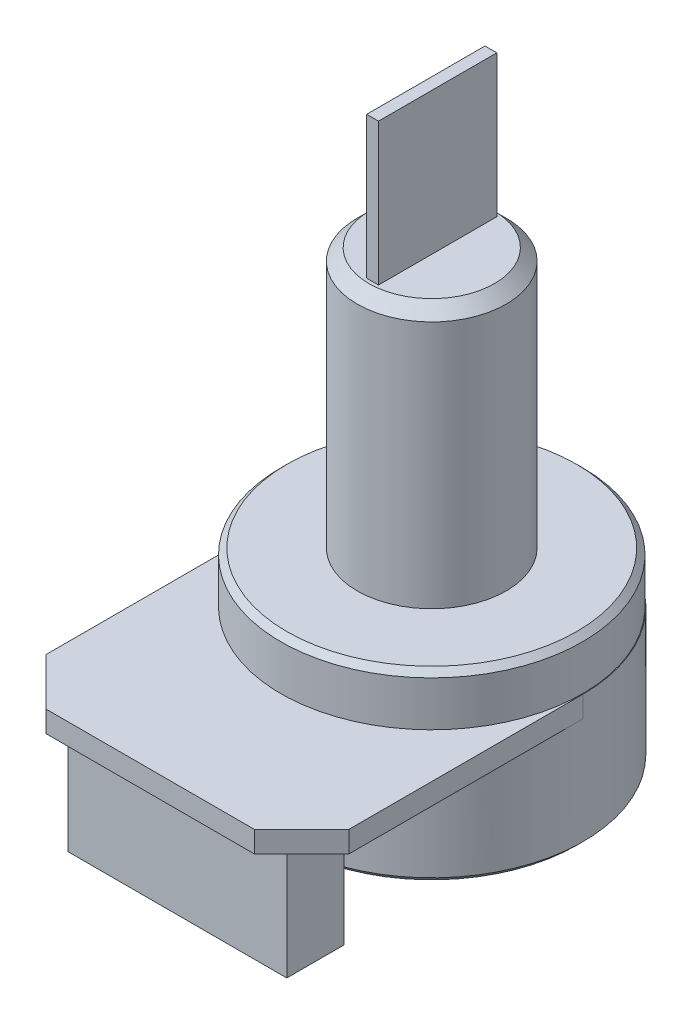
ISO-10303-21;
HEADER;
FILE_DESCRIPTION(('STEP AP214'),'2;1');
FILE_NAME('part.step','',(''),(''),'','','');
FILE_SCHEMA(('AUTOMOTIVE_DESIGN { 1 0 10303 214 1 1 1 1 }'));
ENDSEC;
DATA;
#1=APPLICATION_CONTEXT('core data for automotive mechanical design processes');
#2=APPLICATION_PROTOCOL_DEFINITION('international standard','automotive_design',2000,#1);
#3=PRODUCT_CONTEXT('',#1,'mechanical');
#4=PRODUCT('Part','Part','',(#3));
#5=PRODUCT_RELATED_PRODUCT_CATEGORY('part','',(#4));
#6=PRODUCT_DEFINITION_FORMATION('','',#4);
#7=PRODUCT_DEFINITION_CONTEXT('part definition',#1,'design');
#8=PRODUCT_DEFINITION('design','',#6,#7);
#9=PRODUCT_DEFINITION_SHAPE('','',#8);
#10=(LENGTH_UNIT() NAMED_UNIT(*) SI_UNIT(.MILLI.,.METRE.));
#11=(NAMED_UNIT(*) PLANE_ANGLE_UNIT() SI_UNIT($,.RADIAN.));
#12=(NAMED_UNIT(*) SI_UNIT($,.STERADIAN.) SOLID_ANGLE_UNIT());
#13=UNCERTAINTY_MEASURE_WITH_UNIT(LENGTH_MEASURE(1.E-05),#10,'distance_accuracy_value','');
#14=(GEOMETRIC_REPRESENTATION_CONTEXT(3) GLOBAL_UNCERTAINTY_ASSIGNED_CONTEXT((#13)) GLOBAL_UNIT_ASSIGNED_CONTEXT((#10,
#11,#12)) REPRESENTATION_CONTEXT('',''));
#15=CARTESIAN_POINT('',(0.,0.,0.));
#16=DIRECTION('',(0.,0.,1.));
#17=DIRECTION('',(1.,0.,0.));
#18=AXIS2_PLACEMENT_3D('',#15,#16,#17);
#19=CARTESIAN_POINT('',(0.,9.5,0.));
#20=DIRECTION('',(0.,-1.,0.));
#21=DIRECTION('',(0.,0.,-1.));
#22=AXIS2_PLACEMENT_3D('',#19,#20,#21);
#23=PLANE('',#22);
#24=DIRECTION('',(1.,0.,0.));
#25=VECTOR('',#24,1.);
#26=CARTESIAN_POINT('',(12.8,9.5,23.8));
#27=LINE('',#26,#25);
#28=CARTESIAN_POINT('',(-8.8,9.5,23.8));
#29=VERTEX_POINT('',#28);
#30=CARTESIAN_POINT('',(8.79999999999999,9.5,23.8));
#31=VERTEX_POINT('',#30);
#32=EDGE_CURVE('E225',#29,#31,#27,.T.);
#33=ORIENTED_EDGE('',*,*,#32,.F.);
#34=DIRECTION('',(0.707106781186546,0.,0.707106781186549));
#35=VECTOR('',#34,1.);
#36=CARTESIAN_POINT('',(-16.3,9.5,16.2999999999999));
#37=LINE('',#36,#35);
#38=CARTESIAN_POINT('',(-12.8,9.5,19.8));
#39=VERTEX_POINT('',#38);
#40=EDGE_CURVE('E260',#29,#39,#37,.F.);
#41=ORIENTED_EDGE('',*,*,#40,.T.);
#42=DIRECTION('',(0.,0.,1.));
#43=VECTOR('',#42,1.);
#44=CARTESIAN_POINT('',(-12.8,9.5,23.8));
#45=LINE('',#44,#43);
#46=CARTESIAN_POINT('',(-12.8,9.5,0.));
#47=VERTEX_POINT('',#46);
#48=EDGE_CURVE('E204',#47,#39,#45,.T.);
#49=ORIENTED_EDGE('',*,*,#48,.F.);
#50=CARTESIAN_POINT('',(0.,9.5,0.));
#51=DIRECTION('',(0.,1.,0.));
#52=DIRECTION('',(0.,0.,1.));
#53=AXIS2_PLACEMENT_3D('',#50,#51,#52);
#54=CIRCLE('',#53,12.8);
#55=CARTESIAN_POINT('',(12.8,9.5,0.));
#56=VERTEX_POINT('',#55);
#57=EDGE_CURVE('E212',#47,#56,#54,.T.);
#58=ORIENTED_EDGE('',*,*,#57,.T.);
#59=DIRECTION('',(0.,0.,-1.));
#60=VECTOR('',#59,1.);
#61=CARTESIAN_POINT('',(12.8,9.5,23.8));
#62=LINE('',#61,#60);
#63=CARTESIAN_POINT('',(12.8,9.5,19.8));
#64=VERTEX_POINT('',#63);
#65=EDGE_CURVE('E217',#64,#56,#62,.T.);
#66=ORIENTED_EDGE('',*,*,#65,.F.);
#67=DIRECTION('',(0.707106781186549,0.,-0.707106781186546));
#68=VECTOR('',#67,1.);
#69=CARTESIAN_POINT('',(16.3,9.5,16.3));
#70=LINE('',#69,#68);
#71=EDGE_CURVE('E258',#64,#31,#70,.F.);
#72=ORIENTED_EDGE('',*,*,#71,.T.);
#73=EDGE_LOOP('',(#33,#41,#49,#58,#66,#72));
#74=FACE_BOUND('',#73,.T.);
#75=DIRECTION('',(1.,0.,0.));
#76=VECTOR('',#75,1.);
#77=CARTESIAN_POINT('',(9.25768643719525,9.5,16.6827252048541));
#78=LINE('',#77,#76);
#79=CARTESIAN_POINT('',(-9.25768643719525,9.5,16.6827252048541));
#80=VERTEX_POINT('',#79);
#81=CARTESIAN_POINT('',(9.25768643719525,9.5,16.6827252048541));
#82=VERTEX_POINT('',#81);
#83=EDGE_CURVE('E173',#80,#82,#78,.T.);
#84=ORIENTED_EDGE('',*,*,#83,.F.);
#85=DIRECTION('',(0.,0.,-1.));
#86=VECTOR('',#85,1.);
#87=CARTESIAN_POINT('',(-9.25768643719525,9.5,16.6827252048541));
#88=LINE('',#87,#86);
#89=CARTESIAN_POINT('',(-9.25768643719525,9.5,21.5128224764342));
#90=VERTEX_POINT('',#89);
#91=EDGE_CURVE('E170',#90,#80,#88,.T.);
#92=ORIENTED_EDGE('',*,*,#91,.F.);
#93=DIRECTION('',(-1.,0.,0.));
#94=VECTOR('',#93,1.);
#95=CARTESIAN_POINT('',(9.25768643719525,9.5,21.5128224764342));
#96=LINE('',#95,#94);
#97=CARTESIAN_POINT('',(9.25768643719525,9.5,21.5128224764342));
#98=VERTEX_POINT('',#97);
#99=EDGE_CURVE('E183',#98,#90,#96,.T.);
#100=ORIENTED_EDGE('',*,*,#99,.F.);
#101=DIRECTION('',(0.,0.,1.));
#102=VECTOR('',#101,1.);
#103=CARTESIAN_POINT('',(9.25768643719525,9.5,16.6827252048541));
#104=LINE('',#103,#102);
#105=EDGE_CURVE('E191',#82,#98,#104,.T.);
#106=ORIENTED_EDGE('',*,*,#105,.F.);
#107=EDGE_LOOP('',(#84,#92,#100,#106));
#108=FACE_BOUND('',#107,.T.);
#109=ADVANCED_FACE('F41',(#74,#108),#23,.T.);
#110=CARTESIAN_POINT('',(0.,9.5,0.));
#111=DIRECTION('',(0.,-1.,0.));
#112=DIRECTION('',(0.,0.,-1.));
#113=AXIS2_PLACEMENT_3D('',#110,#111,#112);
#114=CYLINDRICAL_SURFACE('',#113,12.8);
#115=CARTESIAN_POINT('',(0.,0.49999999999999,0.));
#116=DIRECTION('',(0.,1.,0.));
#117=DIRECTION('',(0.,0.,1.));
#118=AXIS2_PLACEMENT_3D('',#115,#116,#117);
#119=CIRCLE('',#118,12.8);
#120=CARTESIAN_POINT('',(0.,0.49999999999999,12.8));
#121=VERTEX_POINT('',#120);
#122=EDGE_CURVE('E241',#121,#121,#119,.T.);
#123=ORIENTED_EDGE('',*,*,#122,.T.);
#124=EDGE_LOOP('',(#123));
#125=FACE_BOUND('',#124,.T.);
#126=ORIENTED_EDGE('',*,*,#57,.F.);
#127=DIRECTION('',(0.,-1.,0.));
#128=VECTOR('',#127,1.);
#129=CARTESIAN_POINT('',(-12.8,11.3,0.));
#130=LINE('',#129,#128);
#131=CARTESIAN_POINT('',(-12.8,11.3,0.));
#132=VERTEX_POINT('',#131);
#133=EDGE_CURVE('E231',#132,#47,#130,.T.);
#134=ORIENTED_EDGE('',*,*,#133,.F.);
#135=CARTESIAN_POINT('',(0.,11.3,0.));
#136=DIRECTION('',(0.,1.,0.));
#137=DIRECTION('',(0.,0.,-1.));
#138=AXIS2_PLACEMENT_3D('',#135,#136,#137);
#139=CIRCLE('',#138,12.8);
#140=CARTESIAN_POINT('',(12.8,11.3,0.));
#141=VERTEX_POINT('',#140);
#142=EDGE_CURVE('E213',#141,#132,#139,.T.);
#143=ORIENTED_EDGE('',*,*,#142,.F.);
#144=DIRECTION('',(0.,-1.,0.));
#145=VECTOR('',#144,1.);
#146=CARTESIAN_POINT('',(12.8,11.3,0.));
#147=LINE('',#146,#145);
#148=EDGE_CURVE('E223',#141,#56,#147,.T.);
#149=ORIENTED_EDGE('',*,*,#148,.T.);
#150=EDGE_LOOP('',(#126,#134,#143,#149));
#151=FACE_BOUND('',#150,.T.);
#152=ADVANCED_FACE('F280',(#125,#151),#114,.T.);
#153=CARTESIAN_POINT('',(0.,0.,0.));
#154=DIRECTION('',(0.,1.,0.));
#155=DIRECTION('',(0.,0.,1.));
#156=AXIS2_PLACEMENT_3D('',#153,#154,#155);
#157=PLANE('',#156);
#158=CARTESIAN_POINT('',(0.,0.,0.));
#159=DIRECTION('',(0.,1.,0.));
#160=DIRECTION('',(0.,0.,1.));
#161=AXIS2_PLACEMENT_3D('',#158,#159,#160);
#162=CIRCLE('',#161,12.3);
#163=CARTESIAN_POINT('',(0.,0.,12.3));
#164=VERTEX_POINT('',#163);
#165=EDGE_CURVE('E244',#164,#164,#162,.F.);
#166=ORIENTED_EDGE('',*,*,#165,.T.);
#167=EDGE_LOOP('',(#166));
#168=FACE_BOUND('',#167,.T.);
#169=ADVANCED_FACE('F298',(#168),#157,.F.);
#170=CARTESIAN_POINT('',(-12.8,11.3,23.8));
#171=DIRECTION('',(1.,0.,0.));
#172=DIRECTION('',(0.,0.,-1.));
#173=AXIS2_PLACEMENT_3D('',#170,#171,#172);
#174=PLANE('',#173);
#175=ORIENTED_EDGE('',*,*,#48,.T.);
#176=DIRECTION('',(0.,1.,0.));
#177=VECTOR('',#176,1.);
#178=CARTESIAN_POINT('',(-12.8,11.3,19.8));
#179=LINE('',#178,#177);
#180=CARTESIAN_POINT('',(-12.8,11.3,19.8));
#181=VERTEX_POINT('',#180);
#182=EDGE_CURVE('E65',#39,#181,#179,.T.);
#183=ORIENTED_EDGE('',*,*,#182,.T.);
#184=DIRECTION('',(0.,0.,1.));
#185=VECTOR('',#184,1.);
#186=CARTESIAN_POINT('',(-12.8,11.3,23.8));
#187=LINE('',#186,#185);
#188=EDGE_CURVE('E216',#132,#181,#187,.T.);
#189=ORIENTED_EDGE('',*,*,#188,.F.);
#190=ORIENTED_EDGE('',*,*,#133,.T.);
#191=EDGE_LOOP('',(#175,#183,#189,#190));
#192=FACE_BOUND('',#191,.T.);
#193=ADVANCED_FACE('F276',(#192),#174,.F.);
#194=CARTESIAN_POINT('',(12.8,11.3,23.8));
#195=DIRECTION('',(0.,0.,-1.));
#196=DIRECTION('',(-1.,0.,0.));
#197=AXIS2_PLACEMENT_3D('',#194,#195,#196);
#198=PLANE('',#197);
#199=DIRECTION('',(1.,0.,0.));
#200=VECTOR('',#199,1.);
#201=CARTESIAN_POINT('',(12.8,11.3,23.8));
#202=LINE('',#201,#200);
#203=CARTESIAN_POINT('',(-8.8,11.3,23.8));
#204=VERTEX_POINT('',#203);
#205=CARTESIAN_POINT('',(8.79999999999999,11.3,23.8));
#206=VERTEX_POINT('',#205);
#207=EDGE_CURVE('E219',#204,#206,#202,.T.);
#208=ORIENTED_EDGE('',*,*,#207,.F.);
#209=DIRECTION('',(0.,-1.,0.));
#210=VECTOR('',#209,1.);
#211=CARTESIAN_POINT('',(-8.8,11.3,23.8));
#212=LINE('',#211,#210);
#213=EDGE_CURVE('E255',#204,#29,#212,.T.);
#214=ORIENTED_EDGE('',*,*,#213,.T.);
#215=ORIENTED_EDGE('',*,*,#32,.T.);
#216=DIRECTION('',(0.,1.,0.));
#217=VECTOR('',#216,1.);
#218=CARTESIAN_POINT('',(8.79999999999999,11.3,23.8));
#219=LINE('',#218,#217);
#220=EDGE_CURVE('E253',#31,#206,#219,.T.);
#221=ORIENTED_EDGE('',*,*,#220,.T.);
#222=EDGE_LOOP('',(#208,#214,#215,#221));
#223=FACE_BOUND('',#222,.T.);
#224=ADVANCED_FACE('F269',(#223),#198,.F.);
#225=CARTESIAN_POINT('',(12.8,11.3,23.8));
#226=DIRECTION('',(-1.,0.,0.));
#227=DIRECTION('',(0.,0.,1.));
#228=AXIS2_PLACEMENT_3D('',#225,#226,#227);
#229=PLANE('',#228);
#230=DIRECTION('',(0.,0.,-1.));
#231=VECTOR('',#230,1.);
#232=CARTESIAN_POINT('',(12.8,11.3,23.8));
#233=LINE('',#232,#231);
#234=CARTESIAN_POINT('',(12.8,11.3,19.8));
#235=VERTEX_POINT('',#234);
#236=EDGE_CURVE('E221',#235,#141,#233,.T.);
#237=ORIENTED_EDGE('',*,*,#236,.F.);
#238=DIRECTION('',(0.,-1.,0.));
#239=VECTOR('',#238,1.);
#240=CARTESIAN_POINT('',(12.8,11.3,19.8));
#241=LINE('',#240,#239);
#242=EDGE_CURVE('E12',#235,#64,#241,.T.);
#243=ORIENTED_EDGE('',*,*,#242,.T.);
#244=ORIENTED_EDGE('',*,*,#65,.T.);
#245=ORIENTED_EDGE('',*,*,#148,.F.);
#246=EDGE_LOOP('',(#237,#243,#244,#245));
#247=FACE_BOUND('',#246,.T.);
#248=ADVANCED_FACE('F284',(#247),#229,.F.);
#249=CARTESIAN_POINT('',(0.,11.3,0.));
#250=DIRECTION('',(0.,-1.,0.));
#251=DIRECTION('',(0.,0.,-1.));
#252=AXIS2_PLACEMENT_3D('',#249,#250,#251);
#253=PLANE('',#252);
#254=CARTESIAN_POINT('',(0.,11.3,0.));
#255=DIRECTION('',(0.,1.,0.));
#256=DIRECTION('',(0.,0.,1.));
#257=AXIS2_PLACEMENT_3D('',#254,#255,#256);
#258=CIRCLE('',#257,12.75);
#259=CARTESIAN_POINT('',(0.,11.3,-12.75));
#260=VERTEX_POINT('',#259);
#261=EDGE_CURVE('E209',#260,#260,#258,.T.);
#262=ORIENTED_EDGE('',*,*,#261,.F.);
#263=EDGE_LOOP('',(#262));
#264=FACE_BOUND('',#263,.T.);
#265=ORIENTED_EDGE('',*,*,#188,.T.);
#266=DIRECTION('',(-0.707106781186546,0.,-0.707106781186549));
#267=VECTOR('',#266,1.);
#268=CARTESIAN_POINT('',(-8.8,11.3,23.8));
#269=LINE('',#268,#267);
#270=EDGE_CURVE('E50',#181,#204,#269,.F.);
#271=ORIENTED_EDGE('',*,*,#270,.T.);
#272=ORIENTED_EDGE('',*,*,#207,.T.);
#273=DIRECTION('',(-0.707106781186549,0.,0.707106781186546));
#274=VECTOR('',#273,1.);
#275=CARTESIAN_POINT('',(12.8,11.3,19.8));
#276=LINE('',#275,#274);
#277=EDGE_CURVE('E57',#206,#235,#276,.F.);
#278=ORIENTED_EDGE('',*,*,#277,.T.);
#279=ORIENTED_EDGE('',*,*,#236,.T.);
#280=ORIENTED_EDGE('',*,*,#142,.T.);
#281=EDGE_LOOP('',(#265,#271,#272,#278,#279,#280));
#282=FACE_BOUND('',#281,.T.);
#283=ADVANCED_FACE('F265',(#264,#282),#253,.F.);
#284=CARTESIAN_POINT('',(0.,67.2624458405139,0.));
#285=DIRECTION('',(0.,-1.,0.));
#286=DIRECTION('',(0.,0.,-1.));
#287=AXIS2_PLACEMENT_3D('',#284,#285,#286);
#288=CYLINDRICAL_SURFACE('',#287,12.75);
#289=CARTESIAN_POINT('',(0.,15.1000000000001,0.));
#290=DIRECTION('',(0.,1.,0.));
#291=DIRECTION('',(0.,0.,1.));
#292=AXIS2_PLACEMENT_3D('',#289,#290,#291);
#293=CIRCLE('',#292,12.75);
#294=CARTESIAN_POINT('',(0.,15.1000000000001,-12.75));
#295=VERTEX_POINT('',#294);
#296=EDGE_CURVE('E250',#295,#295,#293,.F.);
#297=CARTESIAN_POINT('',(0.,15.1000000000001,-12.75));
#298=CARTESIAN_POINT('',(0.,15.0604166666667,-12.75));
#299=CARTESIAN_POINT('',(0.,15.0208333333334,-12.75));
#300=CARTESIAN_POINT('',(0.,14.9416666666667,-12.75));
#301=CARTESIAN_POINT('',(0.,14.9020833333334,-12.75));
#302=CARTESIAN_POINT('',(0.,14.8229166666667,-12.75));
#303=CARTESIAN_POINT('',(0.,14.7833333333334,-12.75));
#304=CARTESIAN_POINT('',(0.,14.7041666666667,-12.75));
#305=CARTESIAN_POINT('',(0.,14.6645833333334,-12.75));
#306=CARTESIAN_POINT('',(0.,14.5854166666667,-12.75));
#307=CARTESIAN_POINT('',(0.,14.5458333333334,-12.75));
#308=CARTESIAN_POINT('',(0.,14.4666666666667,-12.75));
#309=CARTESIAN_POINT('',(0.,14.4270833333334,-12.75));
#310=CARTESIAN_POINT('',(0.,14.3479166666667,-12.75));
#311=CARTESIAN_POINT('',(0.,14.3083333333334,-12.75));
#312=CARTESIAN_POINT('',(0.,14.2291666666667,-12.75));
#313=CARTESIAN_POINT('',(0.,14.1895833333334,-12.75));
#314=CARTESIAN_POINT('',(0.,14.1104166666667,-12.75));
#315=CARTESIAN_POINT('',(0.,14.0708333333334,-12.75));
#316=CARTESIAN_POINT('',(0.,13.9916666666667,-12.75));
#317=CARTESIAN_POINT('',(0.,13.9520833333334,-12.75));
#318=CARTESIAN_POINT('',(0.,13.8729166666667,-12.75));
#319=CARTESIAN_POINT('',(0.,13.8333333333334,-12.75));
#320=CARTESIAN_POINT('',(0.,13.7541666666667,-12.75));
#321=CARTESIAN_POINT('',(0.,13.7145833333334,-12.75));
#322=CARTESIAN_POINT('',(0.,13.6354166666667,-12.75));
#323=CARTESIAN_POINT('',(0.,13.5958333333334,-12.75));
#324=CARTESIAN_POINT('',(0.,13.5166666666667,-12.75));
#325=CARTESIAN_POINT('',(0.,13.4770833333334,-12.75));
#326=CARTESIAN_POINT('',(0.,13.3979166666667,-12.75));
#327=CARTESIAN_POINT('',(0.,13.3583333333334,-12.75));
#328=CARTESIAN_POINT('',(0.,13.2791666666667,-12.75));
#329=CARTESIAN_POINT('',(0.,13.2395833333334,-12.75));
#330=CARTESIAN_POINT('',(0.,13.1604166666667,-12.75));
#331=CARTESIAN_POINT('',(0.,13.1208333333334,-12.75));
#332=CARTESIAN_POINT('',(0.,13.0416666666667,-12.75));
#333=CARTESIAN_POINT('',(0.,13.0020833333334,-12.75));
#334=CARTESIAN_POINT('',(0.,12.9229166666667,-12.75));
#335=CARTESIAN_POINT('',(0.,12.8833333333334,-12.75));
#336=CARTESIAN_POINT('',(0.,12.8041666666667,-12.75));
#337=CARTESIAN_POINT('',(0.,12.7645833333334,-12.75));
#338=CARTESIAN_POINT('',(0.,12.6854166666667,-12.75));
#339=CARTESIAN_POINT('',(0.,12.6458333333333,-12.75));
#340=CARTESIAN_POINT('',(0.,12.5666666666667,-12.75));
#341=CARTESIAN_POINT('',(0.,12.5270833333333,-12.75));
#342=CARTESIAN_POINT('',(0.,12.4479166666667,-12.75));
#343=CARTESIAN_POINT('',(0.,12.4083333333333,-12.75));
#344=CARTESIAN_POINT('',(0.,12.3291666666667,-12.75));
#345=CARTESIAN_POINT('',(0.,12.2895833333333,-12.75));
#346=CARTESIAN_POINT('',(0.,12.2104166666667,-12.75));
#347=CARTESIAN_POINT('',(0.,12.1708333333333,-12.75));
#348=CARTESIAN_POINT('',(0.,12.0916666666667,-12.75));
#349=CARTESIAN_POINT('',(0.,12.0520833333333,-12.75));
#350=CARTESIAN_POINT('',(0.,11.9729166666667,-12.75));
#351=CARTESIAN_POINT('',(0.,11.9333333333333,-12.75));
#352=CARTESIAN_POINT('',(0.,11.8541666666667,-12.75));
#353=CARTESIAN_POINT('',(0.,11.8145833333333,-12.75));
#354=CARTESIAN_POINT('',(0.,11.7354166666667,-12.75));
#355=CARTESIAN_POINT('',(0.,11.6958333333333,-12.75));
#356=CARTESIAN_POINT('',(0.,11.6166666666667,-12.75));
#357=CARTESIAN_POINT('',(0.,11.5770833333333,-12.75));
#358=CARTESIAN_POINT('',(0.,11.4979166666667,-12.75));
#359=CARTESIAN_POINT('',(0.,11.4583333333333,-12.75));
#360=CARTESIAN_POINT('',(0.,11.3791666666667,-12.75));
#361=CARTESIAN_POINT('',(0.,11.3395833333333,-12.75));
#362=CARTESIAN_POINT('',(0.,11.3,-12.75));
#363=B_SPLINE_CURVE_WITH_KNOTS('',3,(#297,#298,#299,#300,#301,#302,#303,#304,#305,#306,#307,
#308,#309,#310,#311,#312,#313,#314,#315,#316,#317,#318,#319,#320,#321,#322,#323,#324,#325,#326,
#327,#328,#329,#330,#331,#332,#333,#334,#335,#336,#337,#338,#339,#340,#341,#342,#343,#344,#345,
#346,#347,#348,#349,#350,#351,#352,#353,#354,#355,#356,#357,#358,#359,#360,#361,#362),
.UNSPECIFIED.,.F.,.F.,(4,2,2,2,2,2,2,2,2,2,2,2,2,2,2,2,2,2,2,2,2,2,2,2,2,2,2,2,2,2,2,2,4),(0.,
0.118750000000001,0.237500000000002,0.356250000000002,0.475000000000003,0.593750000000011,
0.712500000000012,0.831250000000012,0.950000000000013,1.06875000000001,1.18750000000001,
1.30625000000002,1.42500000000002,1.54375000000002,1.66250000000002,1.78125000000003,
1.90000000000003,2.01875000000003,2.13750000000003,2.25625000000003,2.37500000000003,
2.49375000000004,2.61250000000004,2.73125000000004,2.85000000000004,2.96875000000004,
3.08750000000004,3.20625000000004,3.32500000000005,3.44375000000005,3.56250000000005,
3.68125000000005,3.80000000000005),.UNSPECIFIED.);
#364=EDGE_CURVE('BSEAM353',#295,#260,#363,.T.);
#365=ORIENTED_EDGE('',*,*,#296,.T.);
#366=ORIENTED_EDGE('',*,*,#261,.T.);
#367=ORIENTED_EDGE('',*,*,#364,.T.);
#368=ORIENTED_EDGE('',*,*,#364,.F.);
#369=EDGE_LOOP('',(#365,#367,#366,#368));
#370=FACE_BOUND('',#369,.T.);
#371=ADVANCED_FACE('F353',(#370),#288,.T.);
#372=CARTESIAN_POINT('',(0.,15.6,0.));
#373=DIRECTION('',(0.,1.,0.));
#374=DIRECTION('',(0.,0.,1.));
#375=AXIS2_PLACEMENT_3D('',#372,#373,#374);
#376=PLANE('',#375);
#377=CARTESIAN_POINT('',(0.,15.6,0.));
#378=DIRECTION('',(0.,1.,0.));
#379=DIRECTION('',(0.,0.,1.));
#380=AXIS2_PLACEMENT_3D('',#377,#378,#379);
#381=CIRCLE('',#380,12.2500000000001);
#382=CARTESIAN_POINT('',(0.,15.6,12.2500000000001));
#383=VERTEX_POINT('',#382);
#384=EDGE_CURVE('E247',#383,#383,#381,.T.);
#385=ORIENTED_EDGE('',*,*,#384,.T.);
#386=EDGE_LOOP('',(#385));
#387=FACE_BOUND('',#386,.T.);
#388=CARTESIAN_POINT('',(0.,15.6,0.));
#389=DIRECTION('',(0.,1.,0.));
#390=DIRECTION('',(0.,0.,1.));
#391=AXIS2_PLACEMENT_3D('',#388,#389,#390);
#392=CIRCLE('',#391,6.3);
#393=CARTESIAN_POINT('',(0.,15.6,6.3));
#394=VERTEX_POINT('',#393);
#395=EDGE_CURVE('E205',#394,#394,#392,.T.);
#396=ORIENTED_EDGE('',*,*,#395,.F.);
#397=EDGE_LOOP('',(#396));
#398=FACE_BOUND('',#397,.T.);
#399=ADVANCED_FACE('F349',(#387,#398),#376,.T.);
#400=CARTESIAN_POINT('',(0.,93.019090885901,0.));
#401=DIRECTION('',(0.,-1.,0.));
#402=DIRECTION('',(0.,0.,-1.));
#403=AXIS2_PLACEMENT_3D('',#400,#401,#402);
#404=CYLINDRICAL_SURFACE('',#403,6.3);
#405=CARTESIAN_POINT('',(0.,36.6,0.));
#406=DIRECTION('',(0.,1.,0.));
#407=DIRECTION('',(0.,0.,1.));
#408=AXIS2_PLACEMENT_3D('',#405,#406,#407);
#409=CIRCLE('',#408,6.3);
#410=CARTESIAN_POINT('',(0.,36.6,6.3));
#411=VERTEX_POINT('',#410);
#412=EDGE_CURVE('E238',#411,#411,#409,.F.);
#413=ORIENTED_EDGE('',*,*,#412,.T.);
#414=EDGE_LOOP('',(#413));
#415=FACE_BOUND('',#414,.T.);
#416=ORIENTED_EDGE('',*,*,#395,.T.);
#417=EDGE_LOOP('',(#416));
#418=FACE_BOUND('',#417,.T.);
#419=ADVANCED_FACE('F352',(#415,#418),#404,.T.);
#420=CARTESIAN_POINT('',(0.,37.6,0.));
#421=DIRECTION('',(0.,1.,0.));
#422=DIRECTION('',(0.,0.,1.));
#423=AXIS2_PLACEMENT_3D('',#420,#421,#422);
#424=PLANE('',#423);
#425=DIRECTION('',(0.,0.,-1.));
#426=VECTOR('',#425,1.);
#427=CARTESIAN_POINT('',(0.5,37.6,5.));
#428=LINE('',#427,#426);
#429=CARTESIAN_POINT('',(0.5,37.6,5.));
#430=VERTEX_POINT('',#429);
#431=CARTESIAN_POINT('',(0.5,37.6,-5.));
#432=VERTEX_POINT('',#431);
#433=EDGE_CURVE('E169',#430,#432,#428,.T.);
#434=ORIENTED_EDGE('',*,*,#433,.F.);
#435=DIRECTION('',(1.,0.,0.));
#436=VECTOR('',#435,1.);
#437=CARTESIAN_POINT('',(-0.5,37.6,5.));
#438=LINE('',#437,#436);
#439=CARTESIAN_POINT('',(-0.5,37.6,5.));
#440=VERTEX_POINT('',#439);
#441=EDGE_CURVE('E166',#440,#430,#438,.T.);
#442=ORIENTED_EDGE('',*,*,#441,.F.);
#443=DIRECTION('',(0.,0.,1.));
#444=VECTOR('',#443,1.);
#445=CARTESIAN_POINT('',(-0.5,37.6,5.));
#446=LINE('',#445,#444);
#447=CARTESIAN_POINT('',(-0.5,37.6,-5.));
#448=VERTEX_POINT('',#447);
#449=EDGE_CURVE('E615',#448,#440,#446,.T.);
#450=ORIENTED_EDGE('',*,*,#449,.F.);
#451=DIRECTION('',(-1.,0.,0.));
#452=VECTOR('',#451,1.);
#453=CARTESIAN_POINT('',(-0.5,37.6,-5.));
#454=LINE('',#453,#452);
#455=EDGE_CURVE('E617',#432,#448,#454,.T.);
#456=ORIENTED_EDGE('',*,*,#455,.F.);
#457=EDGE_LOOP('',(#434,#442,#450,#456));
#458=FACE_BOUND('',#457,.T.);
#459=CARTESIAN_POINT('',(0.,37.6,0.));
#460=DIRECTION('',(0.,1.,0.));
#461=DIRECTION('',(0.,0.,1.));
#462=AXIS2_PLACEMENT_3D('',#459,#460,#461);
#463=CIRCLE('',#462,5.30000000000001);
#464=CARTESIAN_POINT('',(0.,37.6,5.30000000000001));
#465=VERTEX_POINT('',#464);
#466=EDGE_CURVE('E208',#465,#465,#463,.T.);
#467=ORIENTED_EDGE('',*,*,#466,.T.);
#468=EDGE_LOOP('',(#467));
#469=FACE_BOUND('',#468,.T.);
#470=ADVANCED_FACE('F320',(#458,#469),#424,.T.);
#471=CARTESIAN_POINT('',(0.,37.6,0.));
#472=DIRECTION('',(0.,-1.,0.));
#473=DIRECTION('',(0.,0.,-1.));
#474=AXIS2_PLACEMENT_3D('',#471,#472,#473);
#475=CONICAL_SURFACE('',#474,5.30000000000001,0.785398163397449);
#476=ORIENTED_EDGE('',*,*,#412,.F.);
#477=EDGE_LOOP('',(#476));
#478=FACE_BOUND('',#477,.T.);
#479=ORIENTED_EDGE('',*,*,#466,.F.);
#480=EDGE_LOOP('',(#479));
#481=FACE_BOUND('',#480,.T.);
#482=ADVANCED_FACE('F313',(#478,#481),#475,.T.);
#483=CARTESIAN_POINT('',(0.,0.49999999999999,0.));
#484=DIRECTION('',(0.,1.,0.));
#485=DIRECTION('',(0.,0.,1.));
#486=AXIS2_PLACEMENT_3D('',#483,#484,#485);
#487=CONICAL_SURFACE('',#486,12.8,0.785398163397454);
#488=ORIENTED_EDGE('',*,*,#165,.F.);
#489=EDGE_LOOP('',(#488));
#490=FACE_BOUND('',#489,.T.);
#491=ORIENTED_EDGE('',*,*,#122,.F.);
#492=EDGE_LOOP('',(#491));
#493=FACE_BOUND('',#492,.T.);
#494=ADVANCED_FACE('F319',(#490,#493),#487,.T.);
#495=CARTESIAN_POINT('',(0.,15.6,0.));
#496=DIRECTION('',(0.,-1.,0.));
#497=DIRECTION('',(0.,0.,-1.));
#498=AXIS2_PLACEMENT_3D('',#495,#496,#497);
#499=CONICAL_SURFACE('',#498,12.2500000000001,0.785398163397447);
#500=ORIENTED_EDGE('',*,*,#296,.F.);
#501=EDGE_LOOP('',(#500));
#502=FACE_BOUND('',#501,.T.);
#503=ORIENTED_EDGE('',*,*,#384,.F.);
#504=EDGE_LOOP('',(#503));
#505=FACE_BOUND('',#504,.T.);
#506=ADVANCED_FACE('F327',(#502,#505),#499,.T.);
#507=CARTESIAN_POINT('',(-9.25768643719525,-0.5,16.6827252048541));
#508=DIRECTION('',(1.,0.,0.));
#509=DIRECTION('',(0.,0.,-1.));
#510=AXIS2_PLACEMENT_3D('',#507,#508,#509);
#511=PLANE('',#510);
#512=ORIENTED_EDGE('',*,*,#91,.T.);
#513=DIRECTION('',(0.,1.,0.));
#514=VECTOR('',#513,1.);
#515=CARTESIAN_POINT('',(-9.25768643719525,-0.5,16.6827252048541));
#516=LINE('',#515,#514);
#517=CARTESIAN_POINT('',(-9.25768643719525,-0.5,16.6827252048541));
#518=VERTEX_POINT('',#517);
#519=EDGE_CURVE('E202',#518,#80,#516,.T.);
#520=ORIENTED_EDGE('',*,*,#519,.F.);
#521=DIRECTION('',(0.,0.,-1.));
#522=VECTOR('',#521,1.);
#523=CARTESIAN_POINT('',(-9.25768643719525,-0.5,16.6827252048541));
#524=LINE('',#523,#522);
#525=CARTESIAN_POINT('',(-9.25768643719525,-0.5,21.5128224764342));
#526=VERTEX_POINT('',#525);
#527=EDGE_CURVE('E179',#526,#518,#524,.T.);
#528=ORIENTED_EDGE('',*,*,#527,.F.);
#529=DIRECTION('',(0.,1.,0.));
#530=VECTOR('',#529,1.);
#531=CARTESIAN_POINT('',(-9.25768643719525,-0.5,21.5128224764342));
#532=LINE('',#531,#530);
#533=EDGE_CURVE('E188',#526,#90,#532,.T.);
#534=ORIENTED_EDGE('',*,*,#533,.T.);
#535=EDGE_LOOP('',(#512,#520,#528,#534));
#536=FACE_BOUND('',#535,.T.);
#537=ADVANCED_FACE('F333',(#536),#511,.F.);
#538=CARTESIAN_POINT('',(9.25768643719525,-0.5,16.6827252048541));
#539=DIRECTION('',(0.,0.,1.));
#540=DIRECTION('',(1.,0.,0.));
#541=AXIS2_PLACEMENT_3D('',#538,#539,#540);
#542=PLANE('',#541);
#543=ORIENTED_EDGE('',*,*,#83,.T.);
#544=DIRECTION('',(0.,1.,0.));
#545=VECTOR('',#544,1.);
#546=CARTESIAN_POINT('',(9.25768643719525,-0.5,16.6827252048541));
#547=LINE('',#546,#545);
#548=CARTESIAN_POINT('',(9.25768643719525,-0.5,16.6827252048541));
#549=VERTEX_POINT('',#548);
#550=EDGE_CURVE('E199',#549,#82,#547,.T.);
#551=ORIENTED_EDGE('',*,*,#550,.F.);
#552=DIRECTION('',(1.,0.,0.));
#553=VECTOR('',#552,1.);
#554=CARTESIAN_POINT('',(9.25768643719525,-0.5,16.6827252048541));
#555=LINE('',#554,#553);
#556=EDGE_CURVE('E182',#518,#549,#555,.T.);
#557=ORIENTED_EDGE('',*,*,#556,.F.);
#558=ORIENTED_EDGE('',*,*,#519,.T.);
#559=EDGE_LOOP('',(#543,#551,#557,#558));
#560=FACE_BOUND('',#559,.T.);
#561=ADVANCED_FACE('F342',(#560),#542,.F.);
#562=CARTESIAN_POINT('',(9.25768643719525,-0.5,16.6827252048541));
#563=DIRECTION('',(-1.,0.,0.));
#564=DIRECTION('',(0.,0.,1.));
#565=AXIS2_PLACEMENT_3D('',#562,#563,#564);
#566=PLANE('',#565);
#567=ORIENTED_EDGE('',*,*,#105,.T.);
#568=DIRECTION('',(0.,1.,0.));
#569=VECTOR('',#568,1.);
#570=CARTESIAN_POINT('',(9.25768643719525,-0.5,21.5128224764342));
#571=LINE('',#570,#569);
#572=CARTESIAN_POINT('',(9.25768643719525,-0.5,21.5128224764342));
#573=VERTEX_POINT('',#572);
#574=EDGE_CURVE('E197',#573,#98,#571,.T.);
#575=ORIENTED_EDGE('',*,*,#574,.F.);
#576=DIRECTION('',(0.,0.,1.));
#577=VECTOR('',#576,1.);
#578=CARTESIAN_POINT('',(9.25768643719525,-0.5,16.6827252048541));
#579=LINE('',#578,#577);
#580=EDGE_CURVE('E185',#549,#573,#579,.T.);
#581=ORIENTED_EDGE('',*,*,#580,.F.);
#582=ORIENTED_EDGE('',*,*,#550,.T.);
#583=EDGE_LOOP('',(#567,#575,#581,#582));
#584=FACE_BOUND('',#583,.T.);
#585=ADVANCED_FACE('F454',(#584),#566,.F.);
#586=CARTESIAN_POINT('',(9.25768643719525,-0.5,21.5128224764342));
#587=DIRECTION('',(0.,0.,-1.));
#588=DIRECTION('',(-1.,0.,0.));
#589=AXIS2_PLACEMENT_3D('',#586,#587,#588);
#590=PLANE('',#589);
#591=ORIENTED_EDGE('',*,*,#99,.T.);
#592=ORIENTED_EDGE('',*,*,#533,.F.);
#593=DIRECTION('',(-1.,0.,0.));
#594=VECTOR('',#593,1.);
#595=CARTESIAN_POINT('',(9.25768643719525,-0.5,21.5128224764342));
#596=LINE('',#595,#594);
#597=EDGE_CURVE('E187',#573,#526,#596,.T.);
#598=ORIENTED_EDGE('',*,*,#597,.F.);
#599=ORIENTED_EDGE('',*,*,#574,.T.);
#600=EDGE_LOOP('',(#591,#592,#598,#599));
#601=FACE_BOUND('',#600,.T.);
#602=ADVANCED_FACE('F444',(#601),#590,.F.);
#603=CARTESIAN_POINT('',(0.,-0.5,0.));
#604=DIRECTION('',(0.,-1.,0.));
#605=DIRECTION('',(0.,0.,-1.));
#606=AXIS2_PLACEMENT_3D('',#603,#604,#605);
#607=PLANE('',#606);
#608=ORIENTED_EDGE('',*,*,#527,.T.);
#609=ORIENTED_EDGE('',*,*,#556,.T.);
#610=ORIENTED_EDGE('',*,*,#580,.T.);
#611=ORIENTED_EDGE('',*,*,#597,.T.);
#612=EDGE_LOOP('',(#608,#609,#610,#611));
#613=FACE_BOUND('',#612,.T.);
#614=ADVANCED_FACE('F435',(#613),#607,.T.);
#615=CARTESIAN_POINT('',(0.5,49.6,5.));
#616=DIRECTION('',(-1.,0.,0.));
#617=DIRECTION('',(0.,0.,1.));
#618=AXIS2_PLACEMENT_3D('',#615,#616,#617);
#619=PLANE('',#618);
#620=ORIENTED_EDGE('',*,*,#433,.T.);
#621=DIRECTION('',(0.,-1.,0.));
#622=VECTOR('',#621,1.);
#623=CARTESIAN_POINT('',(0.5,49.6,-5.));
#624=LINE('',#623,#622);
#625=CARTESIAN_POINT('',(0.5,49.6,-5.));
#626=VERTEX_POINT('',#625);
#627=EDGE_CURVE('E150',#626,#432,#624,.T.);
#628=ORIENTED_EDGE('',*,*,#627,.F.);
#629=DIRECTION('',(0.,0.,-1.));
#630=VECTOR('',#629,1.);
#631=CARTESIAN_POINT('',(0.5,49.6,5.));
#632=LINE('',#631,#630);
#633=CARTESIAN_POINT('',(0.5,49.6,5.));
#634=VERTEX_POINT('',#633);
#635=EDGE_CURVE('E157',#634,#626,#632,.T.);
#636=ORIENTED_EDGE('',*,*,#635,.F.);
#637=DIRECTION('',(0.,-1.,0.));
#638=VECTOR('',#637,1.);
#639=CARTESIAN_POINT('',(0.5,49.6,5.));
#640=LINE('',#639,#638);
#641=EDGE_CURVE('E620',#634,#430,#640,.T.);
#642=ORIENTED_EDGE('',*,*,#641,.T.);
#643=EDGE_LOOP('',(#620,#628,#636,#642));
#644=FACE_BOUND('',#643,.T.);
#645=ADVANCED_FACE('F168',(#644),#619,.F.);
#646=CARTESIAN_POINT('',(-0.5,49.6,-5.));
#647=DIRECTION('',(0.,0.,1.));
#648=DIRECTION('',(1.,0.,0.));
#649=AXIS2_PLACEMENT_3D('',#646,#647,#648);
#650=PLANE('',#649);
#651=ORIENTED_EDGE('',*,*,#455,.T.);
#652=DIRECTION('',(0.,-1.,0.));
#653=VECTOR('',#652,1.);
#654=CARTESIAN_POINT('',(-0.5,49.6,-5.));
#655=LINE('',#654,#653);
#656=CARTESIAN_POINT('',(-0.5,49.6,-5.));
#657=VERTEX_POINT('',#656);
#658=EDGE_CURVE('E153',#657,#448,#655,.T.);
#659=ORIENTED_EDGE('',*,*,#658,.F.);
#660=DIRECTION('',(-1.,0.,0.));
#661=VECTOR('',#660,1.);
#662=CARTESIAN_POINT('',(-0.5,49.6,-5.));
#663=LINE('',#662,#661);
#664=EDGE_CURVE('E145',#626,#657,#663,.T.);
#665=ORIENTED_EDGE('',*,*,#664,.F.);
#666=ORIENTED_EDGE('',*,*,#627,.T.);
#667=EDGE_LOOP('',(#651,#659,#665,#666));
#668=FACE_BOUND('',#667,.T.);
#669=ADVANCED_FACE('F148',(#668),#650,.F.);
#670=CARTESIAN_POINT('',(-0.5,49.6,5.));
#671=DIRECTION('',(1.,0.,0.));
#672=DIRECTION('',(0.,0.,-1.));
#673=AXIS2_PLACEMENT_3D('',#670,#671,#672);
#674=PLANE('',#673);
#675=ORIENTED_EDGE('',*,*,#449,.T.);
#676=DIRECTION('',(0.,-1.,0.));
#677=VECTOR('',#676,1.);
#678=CARTESIAN_POINT('',(-0.5,49.6,5.));
#679=LINE('',#678,#677);
#680=CARTESIAN_POINT('',(-0.5,49.6,5.));
#681=VERTEX_POINT('',#680);
#682=EDGE_CURVE('E175',#681,#440,#679,.T.);
#683=ORIENTED_EDGE('',*,*,#682,.F.);
#684=DIRECTION('',(0.,0.,1.));
#685=VECTOR('',#684,1.);
#686=CARTESIAN_POINT('',(-0.5,49.6,5.));
#687=LINE('',#686,#685);
#688=EDGE_CURVE('E156',#657,#681,#687,.T.);
#689=ORIENTED_EDGE('',*,*,#688,.F.);
#690=ORIENTED_EDGE('',*,*,#658,.T.);
#691=EDGE_LOOP('',(#675,#683,#689,#690));
#692=FACE_BOUND('',#691,.T.);
#693=ADVANCED_FACE('F408',(#692),#674,.F.);
#694=CARTESIAN_POINT('',(-0.5,49.6,5.));
#695=DIRECTION('',(0.,0.,-1.));
#696=DIRECTION('',(-1.,0.,0.));
#697=AXIS2_PLACEMENT_3D('',#694,#695,#696);
#698=PLANE('',#697);
#699=ORIENTED_EDGE('',*,*,#441,.T.);
#700=ORIENTED_EDGE('',*,*,#641,.F.);
#701=DIRECTION('',(1.,0.,0.));
#702=VECTOR('',#701,1.);
#703=CARTESIAN_POINT('',(-0.5,49.6,5.));
#704=LINE('',#703,#702);
#705=EDGE_CURVE('E162',#681,#634,#704,.T.);
#706=ORIENTED_EDGE('',*,*,#705,.F.);
#707=ORIENTED_EDGE('',*,*,#682,.T.);
#708=EDGE_LOOP('',(#699,#700,#706,#707));
#709=FACE_BOUND('',#708,.T.);
#710=ADVANCED_FACE('F400',(#709),#698,.F.);
#711=CARTESIAN_POINT('',(0.,49.6,0.));
#712=DIRECTION('',(0.,-1.,0.));
#713=DIRECTION('',(0.,0.,-1.));
#714=AXIS2_PLACEMENT_3D('',#711,#712,#713);
#715=PLANE('',#714);
#716=ORIENTED_EDGE('',*,*,#635,.T.);
#717=ORIENTED_EDGE('',*,*,#664,.T.);
#718=ORIENTED_EDGE('',*,*,#688,.T.);
#719=ORIENTED_EDGE('',*,*,#705,.T.);
#720=EDGE_LOOP('',(#716,#717,#718,#719));
#721=FACE_BOUND('',#720,.T.);
#722=ADVANCED_FACE('F160',(#721),#715,.F.);
#723=CARTESIAN_POINT('',(-8.8,11.3,23.8));
#724=DIRECTION('',(0.707106781186549,0.,-0.707106781186546));
#725=DIRECTION('',(0.,-1.,0.));
#726=AXIS2_PLACEMENT_3D('',#723,#724,#725);
#727=PLANE('',#726);
#728=ORIENTED_EDGE('',*,*,#270,.F.);
#729=ORIENTED_EDGE('',*,*,#182,.F.);
#730=ORIENTED_EDGE('',*,*,#40,.F.);
#731=ORIENTED_EDGE('',*,*,#213,.F.);
#732=EDGE_LOOP('',(#728,#729,#730,#731));
#733=FACE_BOUND('',#732,.T.);
#734=ADVANCED_FACE('F272',(#733),#727,.F.);
#735=CARTESIAN_POINT('',(12.8,11.3,19.8));
#736=DIRECTION('',(-0.707106781186546,0.,-0.707106781186549));
#737=DIRECTION('',(0.,-1.,0.));
#738=AXIS2_PLACEMENT_3D('',#735,#736,#737);
#739=PLANE('',#738);
#740=ORIENTED_EDGE('',*,*,#277,.F.);
#741=ORIENTED_EDGE('',*,*,#220,.F.);
#742=ORIENTED_EDGE('',*,*,#71,.F.);
#743=ORIENTED_EDGE('',*,*,#242,.F.);
#744=EDGE_LOOP('',(#740,#741,#742,#743));
#745=FACE_BOUND('',#744,.T.);
#746=ADVANCED_FACE('F44',(#745),#739,.F.);
#747=CLOSED_SHELL('',(#109,#152,#169,#193,#224,#248,#283,#371,#399,#419,#470,#482,#494,#506,
#537,#561,#585,#602,#614,#645,#669,#693,#710,#722,#734,#746));
#748=MANIFOLD_SOLID_BREP('B2',#747);
#749=ADVANCED_BREP_SHAPE_REPRESENTATION('',(#18,#748),#14);
#750=SHAPE_DEFINITION_REPRESENTATION(#9,#749);
ENDSEC;
END-ISO-10303-21;
